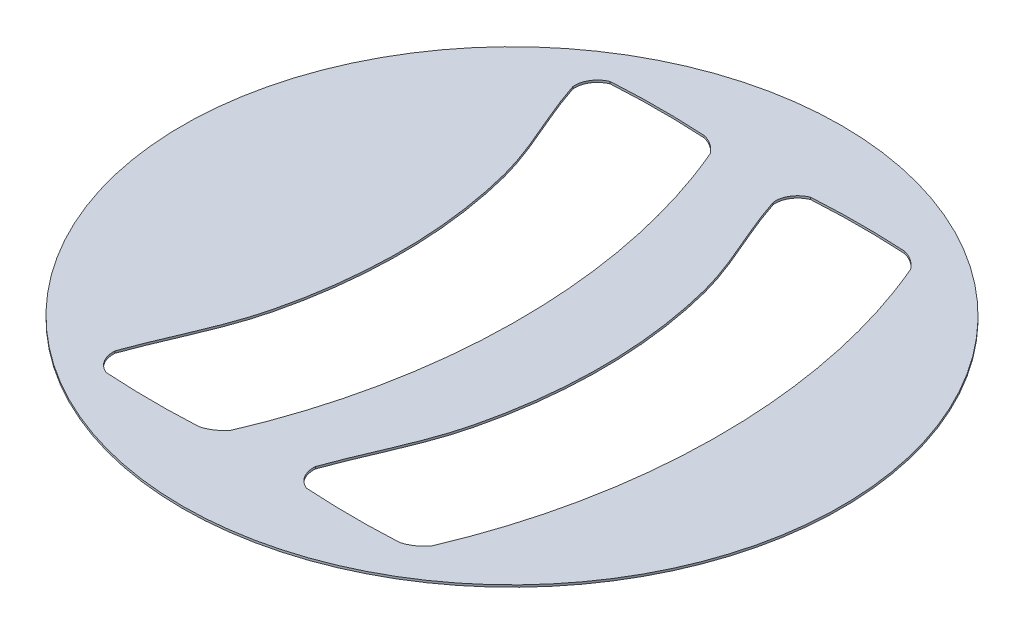
ISO-10303-21;
HEADER;
FILE_DESCRIPTION(('STEP AP214'),'2;1');
FILE_NAME('part.step','',(''),(''),'','','');
FILE_SCHEMA(('AUTOMOTIVE_DESIGN { 1 0 10303 214 1 1 1 1 }'));
ENDSEC;
DATA;
#1=APPLICATION_CONTEXT('core data for automotive mechanical design processes');
#2=APPLICATION_PROTOCOL_DEFINITION('international standard','automotive_design',2000,#1);
#3=PRODUCT_CONTEXT('',#1,'mechanical');
#4=PRODUCT('Part','Part','',(#3));
#5=PRODUCT_RELATED_PRODUCT_CATEGORY('part','',(#4));
#6=PRODUCT_DEFINITION_FORMATION('','',#4);
#7=PRODUCT_DEFINITION_CONTEXT('part definition',#1,'design');
#8=PRODUCT_DEFINITION('design','',#6,#7);
#9=PRODUCT_DEFINITION_SHAPE('','',#8);
#10=(LENGTH_UNIT() NAMED_UNIT(*) SI_UNIT(.MILLI.,.METRE.));
#11=(NAMED_UNIT(*) PLANE_ANGLE_UNIT() SI_UNIT($,.RADIAN.));
#12=(NAMED_UNIT(*) SI_UNIT($,.STERADIAN.) SOLID_ANGLE_UNIT());
#13=UNCERTAINTY_MEASURE_WITH_UNIT(LENGTH_MEASURE(1.E-05),#10,'distance_accuracy_value','');
#14=(GEOMETRIC_REPRESENTATION_CONTEXT(3) GLOBAL_UNCERTAINTY_ASSIGNED_CONTEXT((#13)) GLOBAL_UNIT_ASSIGNED_CONTEXT((#10,
#11,#12)) REPRESENTATION_CONTEXT('',''));
#15=CARTESIAN_POINT('',(0.,0.,0.));
#16=DIRECTION('',(0.,0.,1.));
#17=DIRECTION('',(1.,0.,0.));
#18=AXIS2_PLACEMENT_3D('',#15,#16,#17);
#19=CARTESIAN_POINT('',(-63.760090493305,0.8,86.7960424077123));
#20=CARTESIAN_POINT('',(-58.7628185247075,0.8,72.6085842167443));
#21=CARTESIAN_POINT('',(-51.546745001218,0.8,59.2384097112308));
#22=CARTESIAN_POINT('',(-44.1051711205455,0.8,30.0901740149443));
#23=CARTESIAN_POINT('',(-42.2533943518671,0.8,15.0473839709648));
#24=CARTESIAN_POINT('',(-42.2083653646232,0.8,-15.0362444166191));
#25=CARTESIAN_POINT('',(-44.1048962264668,0.8,-30.0803277028534));
#26=CARTESIAN_POINT('',(-51.5558686408152,0.8,-59.2266051277856));
#27=CARTESIAN_POINT('',(-59.1374389131156,0.8,-72.474291435868));
#28=CARTESIAN_POINT('',(-63.7453578797547,0.8,-86.7929429032606));
#29=B_SPLINE_CURVE_WITH_KNOTS('',3,(#19,#20,#21,#22,#23,#24,#25,#26,#27,#28),.UNSPECIFIED.,.F.,
.F.,(4,2,2,2,4),(0.,0.25,0.5,0.75,1.),.UNSPECIFIED.);
#30=DIRECTION('',(0.,-1.,0.));
#31=VECTOR('',#30,1.);
#32=SURFACE_OF_LINEAR_EXTRUSION('',#29,#31);
#33=CARTESIAN_POINT('',(-63.760090493305,0.,86.7960424077123));
#34=CARTESIAN_POINT('',(-58.7628185247075,0.,72.6085842167443));
#35=CARTESIAN_POINT('',(-51.546745001218,0.,59.2384097112308));
#36=CARTESIAN_POINT('',(-44.1051711205455,0.,30.0901740149443));
#37=CARTESIAN_POINT('',(-42.2533943518671,0.,15.0473839709648));
#38=CARTESIAN_POINT('',(-42.2083653646232,0.,-15.0362444166191));
#39=CARTESIAN_POINT('',(-44.1048962264668,0.,-30.0803277028534));
#40=CARTESIAN_POINT('',(-51.5558686408152,0.,-59.2266051277856));
#41=CARTESIAN_POINT('',(-59.1374389131156,0.,-72.474291435868));
#42=CARTESIAN_POINT('',(-63.7453578797547,0.,-86.7929429032606));
#43=B_SPLINE_CURVE_WITH_KNOTS('',3,(#33,#34,#35,#36,#37,#38,#39,#40,#41,#42),.UNSPECIFIED.,.F.,
.F.,(4,2,2,2,4),(0.,0.25,0.5,0.75,1.),.UNSPECIFIED.);
#44=CARTESIAN_POINT('',(-63.760090493305,0.,86.7960424077123));
#45=VERTEX_POINT('',#44);
#46=CARTESIAN_POINT('',(-63.7453578797547,0.,-86.7929429032606));
#47=VERTEX_POINT('',#46);
#48=EDGE_CURVE('E373',#45,#47,#43,.T.);
#49=ORIENTED_EDGE('',*,*,#48,.T.);
#50=DIRECTION('',(0.,-1.,0.));
#51=VECTOR('',#50,1.);
#52=CARTESIAN_POINT('',(-63.7453578797547,0.8,-86.7929429032606));
#53=LINE('',#52,#51);
#54=CARTESIAN_POINT('',(-63.7453578797547,0.8,-86.7929429032606));
#55=VERTEX_POINT('',#54);
#56=EDGE_CURVE('E11',#55,#47,#53,.T.);
#57=ORIENTED_EDGE('',*,*,#56,.F.);
#58=CARTESIAN_POINT('',(-63.760090493305,0.8,86.7960424077123));
#59=VERTEX_POINT('',#58);
#60=EDGE_CURVE('E234',#59,#55,#29,.T.);
#61=ORIENTED_EDGE('',*,*,#60,.F.);
#62=DIRECTION('',(0.,-1.,0.));
#63=VECTOR('',#62,1.);
#64=CARTESIAN_POINT('',(-63.760090493305,0.8,86.7960424077123));
#65=LINE('',#64,#63);
#66=EDGE_CURVE('E415',#59,#45,#65,.T.);
#67=ORIENTED_EDGE('',*,*,#66,.T.);
#68=EDGE_LOOP('',(#49,#57,#61,#67));
#69=FACE_BOUND('',#68,.T.);
#70=ADVANCED_FACE('F40',(#69),#32,.F.);
#71=CARTESIAN_POINT('',(-63.7453578797547,0.8,-86.7929429032605));
#72=CARTESIAN_POINT('',(-64.138441060353,0.8,-90.601686389006));
#73=CARTESIAN_POINT('',(-61.8806418854337,0.8,-94.0724366599432));
#74=CARTESIAN_POINT('',(-58.3625296994832,0.8,-95.5837036694846));
#75=B_SPLINE_CURVE_WITH_KNOTS('',3,(#71,#72,#73,#74),.UNSPECIFIED.,.F.,.F.,(4,4),(0.,1.),.UNSPECIFIED.);
#76=DIRECTION('',(0.,-1.,0.));
#77=VECTOR('',#76,1.);
#78=SURFACE_OF_LINEAR_EXTRUSION('',#75,#77);
#79=CARTESIAN_POINT('',(-63.7453578797547,0.,-86.7929429032605));
#80=CARTESIAN_POINT('',(-64.138441060353,0.,-90.601686389006));
#81=CARTESIAN_POINT('',(-61.8806418854337,0.,-94.0724366599432));
#82=CARTESIAN_POINT('',(-58.3625296994832,0.,-95.5837036694846));
#83=B_SPLINE_CURVE_WITH_KNOTS('',3,(#79,#80,#81,#82),.UNSPECIFIED.,.F.,.F.,(4,4),(0.,1.),.UNSPECIFIED.);
#84=CARTESIAN_POINT('',(-58.3625296994832,0.,-95.5837036694837));
#85=VERTEX_POINT('',#84);
#86=EDGE_CURVE('E381',#47,#85,#83,.T.);
#87=ORIENTED_EDGE('',*,*,#86,.T.);
#88=DIRECTION('',(0.,-1.,0.));
#89=VECTOR('',#88,1.);
#90=CARTESIAN_POINT('',(-58.3625296994832,0.8,-95.5837036694837));
#91=LINE('',#90,#89);
#92=CARTESIAN_POINT('',(-58.3625296994832,0.8,-95.5837036694837));
#93=VERTEX_POINT('',#92);
#94=EDGE_CURVE('E50',#93,#85,#91,.T.);
#95=ORIENTED_EDGE('',*,*,#94,.F.);
#96=EDGE_CURVE('E229',#55,#93,#75,.T.);
#97=ORIENTED_EDGE('',*,*,#96,.F.);
#98=ORIENTED_EDGE('',*,*,#56,.T.);
#99=EDGE_LOOP('',(#87,#95,#97,#98));
#100=FACE_BOUND('',#99,.T.);
#101=ADVANCED_FACE('F243',(#100),#78,.F.);
#102=CARTESIAN_POINT('',(-39.8465374099125,0.8,193.334513294458));
#103=DIRECTION('',(0.,-1.,0.));
#104=DIRECTION('',(0.,0.,-1.));
#105=AXIS2_PLACEMENT_3D('',#102,#103,#104);
#106=CYLINDRICAL_SURFACE('',#105,289.510929092652);
#107=CARTESIAN_POINT('',(-39.8465374099125,0.,193.334513294458));
#108=DIRECTION('',(0.,1.,0.));
#109=DIRECTION('',(0.,0.,1.));
#110=AXIS2_PLACEMENT_3D('',#107,#108,#109);
#111=CIRCLE('',#110,289.510929092652);
#112=CARTESIAN_POINT('',(-22.840181977188,0.,-95.6764933108036));
#113=VERTEX_POINT('',#112);
#114=EDGE_CURVE('E388',#85,#113,#111,.F.);
#115=ORIENTED_EDGE('',*,*,#114,.T.);
#116=DIRECTION('',(0.,-1.,0.));
#117=VECTOR('',#116,1.);
#118=CARTESIAN_POINT('',(-22.840181977188,0.8,-95.6764933108036));
#119=LINE('',#118,#117);
#120=CARTESIAN_POINT('',(-22.840181977188,0.8,-95.6764933108036));
#121=VERTEX_POINT('',#120);
#122=EDGE_CURVE('E424',#121,#113,#119,.T.);
#123=ORIENTED_EDGE('',*,*,#122,.F.);
#124=CARTESIAN_POINT('',(-39.8465374099125,0.8,193.334513294458));
#125=DIRECTION('',(0.,1.,0.));
#126=DIRECTION('',(0.,0.,1.));
#127=AXIS2_PLACEMENT_3D('',#124,#125,#126);
#128=CIRCLE('',#127,289.510929092652);
#129=EDGE_CURVE('E224',#93,#121,#128,.F.);
#130=ORIENTED_EDGE('',*,*,#129,.F.);
#131=ORIENTED_EDGE('',*,*,#94,.T.);
#132=EDGE_LOOP('',(#115,#123,#130,#131));
#133=FACE_BOUND('',#132,.T.);
#134=ADVANCED_FACE('F246',(#133),#106,.F.);
#135=CARTESIAN_POINT('',(-22.8401819771896,0.8,-95.6764933108048));
#136=CARTESIAN_POINT('',(-19.9176540295161,0.8,-94.9962312894756));
#137=CARTESIAN_POINT('',(-17.4357990087601,0.8,-93.1947706150574));
#138=CARTESIAN_POINT('',(-15.6381900856996,0.8,-90.7921619947685));
#139=B_SPLINE_CURVE_WITH_KNOTS('',3,(#135,#136,#137,#138),.UNSPECIFIED.,.F.,.F.,(4,4),(0.,1.),.UNSPECIFIED.);
#140=DIRECTION('',(0.,-1.,0.));
#141=VECTOR('',#140,1.);
#142=SURFACE_OF_LINEAR_EXTRUSION('',#139,#141);
#143=CARTESIAN_POINT('',(-22.8401819771896,0.,-95.6764933108048));
#144=CARTESIAN_POINT('',(-19.9176540295161,0.,-94.9962312894756));
#145=CARTESIAN_POINT('',(-17.4357990087601,0.,-93.1947706150574));
#146=CARTESIAN_POINT('',(-15.6381900856996,0.,-90.7921619947685));
#147=B_SPLINE_CURVE_WITH_KNOTS('',3,(#143,#144,#145,#146),.UNSPECIFIED.,.F.,.F.,(4,4),(0.,1.),.UNSPECIFIED.);
#148=CARTESIAN_POINT('',(-15.6381900857,0.,-90.7921619947693));
#149=VERTEX_POINT('',#148);
#150=EDGE_CURVE('E393',#113,#149,#147,.T.);
#151=ORIENTED_EDGE('',*,*,#150,.T.);
#152=DIRECTION('',(0.,-1.,0.));
#153=VECTOR('',#152,1.);
#154=CARTESIAN_POINT('',(-15.6381900857,0.8,-90.7921619947693));
#155=LINE('',#154,#153);
#156=CARTESIAN_POINT('',(-15.6381900857,0.8,-90.7921619947693));
#157=VERTEX_POINT('',#156);
#158=EDGE_CURVE('E422',#157,#149,#155,.T.);
#159=ORIENTED_EDGE('',*,*,#158,.F.);
#160=EDGE_CURVE('E219',#121,#157,#139,.T.);
#161=ORIENTED_EDGE('',*,*,#160,.F.);
#162=ORIENTED_EDGE('',*,*,#122,.T.);
#163=EDGE_LOOP('',(#151,#159,#161,#162));
#164=FACE_BOUND('',#163,.T.);
#165=ADVANCED_FACE('F214',(#164),#142,.F.);
#166=CARTESIAN_POINT('',(-154.646830689824,0.8,-0.187171784051202));
#167=DIRECTION('',(0.,1.,0.));
#168=DIRECTION('',(0.00271674553066771,0.,0.999996309640051));
#169=AXIS2_PLACEMENT_3D('',#166,#167,#168);
#170=ELLIPSE('',#169,194.151293524427,157.268621177229);
#171=DIRECTION('',(0.,-1.,0.));
#172=VECTOR('',#171,1.);
#173=SURFACE_OF_LINEAR_EXTRUSION('',#170,#172);
#174=CARTESIAN_POINT('',(-154.646830689824,0.,-0.187171784051202));
#175=DIRECTION('',(0.,1.,0.));
#176=DIRECTION('',(0.00271674553066771,0.,0.999996309640051));
#177=AXIS2_PLACEMENT_3D('',#174,#175,#176);
#178=ELLIPSE('',#177,194.151293524427,157.268621177229);
#179=CARTESIAN_POINT('',(-15.6493149665801,0.,90.8395591257512));
#180=VERTEX_POINT('',#179);
#181=EDGE_CURVE('E398',#180,#149,#178,.T.);
#182=ORIENTED_EDGE('',*,*,#181,.F.);
#183=DIRECTION('',(0.,-1.,0.));
#184=VECTOR('',#183,1.);
#185=CARTESIAN_POINT('',(-15.6493149665801,0.8,90.8395591257512));
#186=LINE('',#185,#184);
#187=CARTESIAN_POINT('',(-15.6493149665801,0.8,90.8395591257512));
#188=VERTEX_POINT('',#187);
#189=EDGE_CURVE('E179',#188,#180,#186,.T.);
#190=ORIENTED_EDGE('',*,*,#189,.F.);
#191=EDGE_CURVE('E172',#188,#157,#170,.T.);
#192=ORIENTED_EDGE('',*,*,#191,.T.);
#193=ORIENTED_EDGE('',*,*,#158,.T.);
#194=EDGE_LOOP('',(#182,#190,#192,#193));
#195=FACE_BOUND('',#194,.T.);
#196=ADVANCED_FACE('F211',(#195),#173,.T.);
#197=CARTESIAN_POINT('',(-15.6493149665797,0.8,90.8395591257503));
#198=CARTESIAN_POINT('',(-17.4637409886561,0.8,93.2547276595145));
#199=CARTESIAN_POINT('',(-19.9919420951581,0.8,95.0053504628634));
#200=CARTESIAN_POINT('',(-22.9156128585138,0.8,95.7651728786771));
#201=B_SPLINE_CURVE_WITH_KNOTS('',3,(#197,#198,#199,#200),.UNSPECIFIED.,.F.,.F.,(4,4),(0.,1.),.UNSPECIFIED.);
#202=DIRECTION('',(0.,-1.,0.));
#203=VECTOR('',#202,1.);
#204=SURFACE_OF_LINEAR_EXTRUSION('',#201,#203);
#205=CARTESIAN_POINT('',(-15.6493149665797,0.,90.8395591257503));
#206=CARTESIAN_POINT('',(-17.4637409886561,0.,93.2547276595145));
#207=CARTESIAN_POINT('',(-19.9919420951581,0.,95.0053504628634));
#208=CARTESIAN_POINT('',(-22.9156128585138,0.,95.7651728786771));
#209=B_SPLINE_CURVE_WITH_KNOTS('',3,(#205,#206,#207,#208),.UNSPECIFIED.,.F.,.F.,(4,4),(0.,1.),.UNSPECIFIED.);
#210=CARTESIAN_POINT('',(-22.915612858512,0.,95.7651728786768));
#211=VERTEX_POINT('',#210);
#212=EDGE_CURVE('E178',#180,#211,#209,.T.);
#213=ORIENTED_EDGE('',*,*,#212,.T.);
#214=DIRECTION('',(0.,-1.,0.));
#215=VECTOR('',#214,1.);
#216=CARTESIAN_POINT('',(-22.915612858512,0.8,95.7651728786768));
#217=LINE('',#216,#215);
#218=CARTESIAN_POINT('',(-22.915612858512,0.8,95.7651728786768));
#219=VERTEX_POINT('',#218);
#220=EDGE_CURVE('E175',#219,#211,#217,.T.);
#221=ORIENTED_EDGE('',*,*,#220,.F.);
#222=EDGE_CURVE('E166',#188,#219,#201,.T.);
#223=ORIENTED_EDGE('',*,*,#222,.F.);
#224=ORIENTED_EDGE('',*,*,#189,.T.);
#225=EDGE_LOOP('',(#213,#221,#223,#224));
#226=FACE_BOUND('',#225,.T.);
#227=ADVANCED_FACE('F176',(#226),#204,.F.);
#228=CARTESIAN_POINT('',(-39.1939977177405,0.8,-200.020572821292));
#229=DIRECTION('',(0.,-1.,0.));
#230=DIRECTION('',(0.,0.,-1.));
#231=AXIS2_PLACEMENT_3D('',#228,#229,#230);
#232=CYLINDRICAL_SURFACE('',#231,296.233342439556);
#233=CARTESIAN_POINT('',(-39.1939977177405,0.,-200.020572821292));
#234=DIRECTION('',(0.,1.,0.));
#235=DIRECTION('',(0.,0.,1.));
#236=AXIS2_PLACEMENT_3D('',#233,#234,#235);
#237=CIRCLE('',#236,296.233342439556);
#238=CARTESIAN_POINT('',(-58.362853206488,0.,95.5919237889887));
#239=VERTEX_POINT('',#238);
#240=EDGE_CURVE('E112',#211,#239,#237,.F.);
#241=ORIENTED_EDGE('',*,*,#240,.T.);
#242=DIRECTION('',(0.,-1.,0.));
#243=VECTOR('',#242,1.);
#244=CARTESIAN_POINT('',(-58.362853206488,0.8,95.5919237889887));
#245=LINE('',#244,#243);
#246=CARTESIAN_POINT('',(-58.362853206488,0.8,95.5919237889887));
#247=VERTEX_POINT('',#246);
#248=EDGE_CURVE('E180',#247,#239,#245,.T.);
#249=ORIENTED_EDGE('',*,*,#248,.F.);
#250=CARTESIAN_POINT('',(-39.1939977177405,0.8,-200.020572821292));
#251=DIRECTION('',(0.,1.,0.));
#252=DIRECTION('',(0.,0.,1.));
#253=AXIS2_PLACEMENT_3D('',#250,#251,#252);
#254=CIRCLE('',#253,296.233342439556);
#255=EDGE_CURVE('E170',#219,#247,#254,.F.);
#256=ORIENTED_EDGE('',*,*,#255,.F.);
#257=ORIENTED_EDGE('',*,*,#220,.T.);
#258=EDGE_LOOP('',(#241,#249,#256,#257));
#259=FACE_BOUND('',#258,.T.);
#260=ADVANCED_FACE('F182',(#259),#232,.F.);
#261=CARTESIAN_POINT('',(36.1534625900875,0.8,193.334513294455));
#262=DIRECTION('',(0.,-1.,0.));
#263=DIRECTION('',(0.,0.,-1.));
#264=AXIS2_PLACEMENT_3D('',#261,#262,#263);
#265=CYLINDRICAL_SURFACE('',#264,289.510929092649);
#266=CARTESIAN_POINT('',(36.1534625900875,0.,193.334513294455));
#267=DIRECTION('',(0.,1.,0.));
#268=DIRECTION('',(0.,0.,1.));
#269=AXIS2_PLACEMENT_3D('',#266,#267,#268);
#270=CIRCLE('',#269,289.510929092649);
#271=CARTESIAN_POINT('',(17.6374703005169,0.,-95.5837036694837));
#272=VERTEX_POINT('',#271);
#273=CARTESIAN_POINT('',(53.1598180228121,0.,-95.6764933108036));
#274=VERTEX_POINT('',#273);
#275=EDGE_CURVE('E328',#272,#274,#270,.F.);
#276=ORIENTED_EDGE('',*,*,#275,.T.);
#277=DIRECTION('',(0.,-1.,0.));
#278=VECTOR('',#277,1.);
#279=CARTESIAN_POINT('',(53.1598180228121,0.8,-95.6764933108036));
#280=LINE('',#279,#278);
#281=CARTESIAN_POINT('',(53.1598180228121,0.8,-95.6764933108036));
#282=VERTEX_POINT('',#281);
#283=EDGE_CURVE('E44',#282,#274,#280,.T.);
#284=ORIENTED_EDGE('',*,*,#283,.F.);
#285=CARTESIAN_POINT('',(36.1534625900875,0.8,193.334513294455));
#286=DIRECTION('',(0.,1.,0.));
#287=DIRECTION('',(0.,0.,1.));
#288=AXIS2_PLACEMENT_3D('',#285,#286,#287);
#289=CIRCLE('',#288,289.510929092649);
#290=CARTESIAN_POINT('',(17.6374703005169,0.8,-95.5837036694837));
#291=VERTEX_POINT('',#290);
#292=EDGE_CURVE('E313',#291,#282,#289,.F.);
#293=ORIENTED_EDGE('',*,*,#292,.F.);
#294=DIRECTION('',(0.,-1.,0.));
#295=VECTOR('',#294,1.);
#296=CARTESIAN_POINT('',(17.6374703005169,0.8,-95.5837036694837));
#297=LINE('',#296,#295);
#298=EDGE_CURVE('E184',#291,#272,#297,.T.);
#299=ORIENTED_EDGE('',*,*,#298,.T.);
#300=EDGE_LOOP('',(#276,#284,#293,#299));
#301=FACE_BOUND('',#300,.T.);
#302=ADVANCED_FACE('F208',(#301),#265,.F.);
#303=CARTESIAN_POINT('',(53.1598180228117,0.8,-95.6764933108038));
#304=CARTESIAN_POINT('',(56.0823459704891,0.8,-94.9962312894761));
#305=CARTESIAN_POINT('',(58.5642009912423,0.8,-93.194770615059));
#306=CARTESIAN_POINT('',(60.3618099143041,0.8,-90.7921619947709));
#307=B_SPLINE_CURVE_WITH_KNOTS('',3,(#303,#304,#305,#306),.UNSPECIFIED.,.F.,.F.,(4,4),(0.,1.),.UNSPECIFIED.);
#308=DIRECTION('',(0.,-1.,0.));
#309=VECTOR('',#308,1.);
#310=SURFACE_OF_LINEAR_EXTRUSION('',#307,#309);
#311=CARTESIAN_POINT('',(53.1598180228117,0.,-95.6764933108038));
#312=CARTESIAN_POINT('',(56.0823459704891,0.,-94.9962312894761));
#313=CARTESIAN_POINT('',(58.5642009912423,0.,-93.194770615059));
#314=CARTESIAN_POINT('',(60.3618099143041,0.,-90.7921619947709));
#315=B_SPLINE_CURVE_WITH_KNOTS('',3,(#311,#312,#313,#314),.UNSPECIFIED.,.F.,.F.,(4,4),(0.,1.),.UNSPECIFIED.);
#316=CARTESIAN_POINT('',(60.361809914304,0.,-90.7921619947711));
#317=VERTEX_POINT('',#316);
#318=EDGE_CURVE('E333',#274,#317,#315,.T.);
#319=ORIENTED_EDGE('',*,*,#318,.T.);
#320=DIRECTION('',(0.,-1.,0.));
#321=VECTOR('',#320,1.);
#322=CARTESIAN_POINT('',(60.361809914304,0.8,-90.7921619947711));
#323=LINE('',#322,#321);
#324=CARTESIAN_POINT('',(60.361809914304,0.8,-90.7921619947711));
#325=VERTEX_POINT('',#324);
#326=EDGE_CURVE('E443',#325,#317,#323,.T.);
#327=ORIENTED_EDGE('',*,*,#326,.F.);
#328=EDGE_CURVE('E127',#282,#325,#307,.T.);
#329=ORIENTED_EDGE('',*,*,#328,.F.);
#330=ORIENTED_EDGE('',*,*,#283,.T.);
#331=EDGE_LOOP('',(#319,#327,#329,#330));
#332=FACE_BOUND('',#331,.T.);
#333=ADVANCED_FACE('F318',(#332),#310,.F.);
#334=CARTESIAN_POINT('',(-78.6468306899286,0.8,-0.187171784053655));
#335=DIRECTION('',(0.,1.,0.));
#336=DIRECTION('',(0.00271674553070339,0.,0.999996309640051));
#337=AXIS2_PLACEMENT_3D('',#334,#335,#336);
#338=ELLIPSE('',#337,194.151293524493,157.268621177338);
#339=DIRECTION('',(0.,-1.,0.));
#340=VECTOR('',#339,1.);
#341=SURFACE_OF_LINEAR_EXTRUSION('',#338,#340);
#342=CARTESIAN_POINT('',(-78.6468306899286,0.,-0.187171784053655));
#343=DIRECTION('',(0.,1.,0.));
#344=DIRECTION('',(0.00271674553070339,0.,0.999996309640051));
#345=AXIS2_PLACEMENT_3D('',#342,#343,#344);
#346=ELLIPSE('',#345,194.151293524493,157.268621177338);
#347=CARTESIAN_POINT('',(60.3506850334238,0.,90.8395591257529));
#348=VERTEX_POINT('',#347);
#349=EDGE_CURVE('E335',#348,#317,#346,.T.);
#350=ORIENTED_EDGE('',*,*,#349,.F.);
#351=DIRECTION('',(0.,-1.,0.));
#352=VECTOR('',#351,1.);
#353=CARTESIAN_POINT('',(60.3506850334238,0.8,90.8395591257529));
#354=LINE('',#353,#352);
#355=CARTESIAN_POINT('',(60.3506850334238,0.8,90.8395591257529));
#356=VERTEX_POINT('',#355);
#357=EDGE_CURVE('E442',#356,#348,#354,.T.);
#358=ORIENTED_EDGE('',*,*,#357,.F.);
#359=EDGE_CURVE('E302',#356,#325,#338,.T.);
#360=ORIENTED_EDGE('',*,*,#359,.T.);
#361=ORIENTED_EDGE('',*,*,#326,.T.);
#362=EDGE_LOOP('',(#350,#358,#360,#361));
#363=FACE_BOUND('',#362,.T.);
#364=ADVANCED_FACE('F294',(#363),#341,.T.);
#365=CARTESIAN_POINT('',(60.3506850334239,0.8,90.8395591257527));
#366=CARTESIAN_POINT('',(58.5362590113465,0.8,93.254727659516));
#367=CARTESIAN_POINT('',(56.0080579048401,0.8,95.0053504628638));
#368=CARTESIAN_POINT('',(53.0843871414876,0.8,95.7651728786762));
#369=B_SPLINE_CURVE_WITH_KNOTS('',3,(#365,#366,#367,#368),.UNSPECIFIED.,.F.,.F.,(4,4),(0.,1.),.UNSPECIFIED.);
#370=DIRECTION('',(0.,-1.,0.));
#371=VECTOR('',#370,1.);
#372=SURFACE_OF_LINEAR_EXTRUSION('',#369,#371);
#373=CARTESIAN_POINT('',(60.3506850334239,0.,90.8395591257527));
#374=CARTESIAN_POINT('',(58.5362590113465,0.,93.254727659516));
#375=CARTESIAN_POINT('',(56.0080579048401,0.,95.0053504628638));
#376=CARTESIAN_POINT('',(53.0843871414876,0.,95.7651728786762));
#377=B_SPLINE_CURVE_WITH_KNOTS('',3,(#373,#374,#375,#376),.UNSPECIFIED.,.F.,.F.,(4,4),(0.,1.),.UNSPECIFIED.);
#378=CARTESIAN_POINT('',(53.0843871414879,0.,95.7651728786759));
#379=VERTEX_POINT('',#378);
#380=EDGE_CURVE('E346',#348,#379,#377,.T.);
#381=ORIENTED_EDGE('',*,*,#380,.T.);
#382=DIRECTION('',(0.,-1.,0.));
#383=VECTOR('',#382,1.);
#384=CARTESIAN_POINT('',(53.0843871414879,0.8,95.7651728786759));
#385=LINE('',#384,#383);
#386=CARTESIAN_POINT('',(53.0843871414879,0.8,95.7651728786759));
#387=VERTEX_POINT('',#386);
#388=EDGE_CURVE('E439',#387,#379,#385,.T.);
#389=ORIENTED_EDGE('',*,*,#388,.F.);
#390=EDGE_CURVE('E298',#356,#387,#369,.T.);
#391=ORIENTED_EDGE('',*,*,#390,.F.);
#392=ORIENTED_EDGE('',*,*,#357,.T.);
#393=EDGE_LOOP('',(#381,#389,#391,#392));
#394=FACE_BOUND('',#393,.T.);
#395=ADVANCED_FACE('F290',(#394),#372,.F.);
#396=CARTESIAN_POINT('',(36.8060022822463,0.8,-200.020572821295));
#397=DIRECTION('',(0.,-1.,0.));
#398=DIRECTION('',(0.,0.,-1.));
#399=AXIS2_PLACEMENT_3D('',#396,#397,#398);
#400=CYLINDRICAL_SURFACE('',#399,296.23334243956);
#401=CARTESIAN_POINT('',(36.8060022822463,0.,-200.020572821295));
#402=DIRECTION('',(0.,1.,0.));
#403=DIRECTION('',(0.,0.,1.));
#404=AXIS2_PLACEMENT_3D('',#401,#402,#403);
#405=CIRCLE('',#404,296.23334243956);
#406=CARTESIAN_POINT('',(17.6371467935119,0.,95.5919237889895));
#407=VERTEX_POINT('',#406);
#408=EDGE_CURVE('E350',#379,#407,#405,.F.);
#409=ORIENTED_EDGE('',*,*,#408,.T.);
#410=DIRECTION('',(0.,-1.,0.));
#411=VECTOR('',#410,1.);
#412=CARTESIAN_POINT('',(17.6371467935119,0.8,95.5919237889895));
#413=LINE('',#412,#411);
#414=CARTESIAN_POINT('',(17.6371467935119,0.8,95.5919237889895));
#415=VERTEX_POINT('',#414);
#416=EDGE_CURVE('E436',#415,#407,#413,.T.);
#417=ORIENTED_EDGE('',*,*,#416,.F.);
#418=CARTESIAN_POINT('',(36.8060022822463,0.8,-200.020572821295));
#419=DIRECTION('',(0.,1.,0.));
#420=DIRECTION('',(0.,0.,1.));
#421=AXIS2_PLACEMENT_3D('',#418,#419,#420);
#422=CIRCLE('',#421,296.23334243956);
#423=EDGE_CURVE('E278',#387,#415,#422,.F.);
#424=ORIENTED_EDGE('',*,*,#423,.F.);
#425=ORIENTED_EDGE('',*,*,#388,.T.);
#426=EDGE_LOOP('',(#409,#417,#424,#425));
#427=FACE_BOUND('',#426,.T.);
#428=ADVANCED_FACE('F286',(#427),#400,.F.);
#429=CARTESIAN_POINT('',(17.6371467935118,0.8,95.5919237889894));
#430=CARTESIAN_POINT('',(14.0789188578137,0.8,94.1778417705216));
#431=CARTESIAN_POINT('',(11.9667711870911,0.8,90.6152058574449));
#432=CARTESIAN_POINT('',(12.2399095066951,0.8,86.7960424077128));
#433=B_SPLINE_CURVE_WITH_KNOTS('',3,(#429,#430,#431,#432),.UNSPECIFIED.,.F.,.F.,(4,4),(0.,1.),.UNSPECIFIED.);
#434=DIRECTION('',(0.,-1.,0.));
#435=VECTOR('',#434,1.);
#436=SURFACE_OF_LINEAR_EXTRUSION('',#433,#435);
#437=CARTESIAN_POINT('',(17.6371467935118,0.,95.5919237889894));
#438=CARTESIAN_POINT('',(14.0789188578137,0.,94.1778417705216));
#439=CARTESIAN_POINT('',(11.9667711870911,0.,90.6152058574449));
#440=CARTESIAN_POINT('',(12.2399095066951,0.,86.7960424077128));
#441=B_SPLINE_CURVE_WITH_KNOTS('',3,(#437,#438,#439,#440),.UNSPECIFIED.,.F.,.F.,(4,4),(0.,1.),.UNSPECIFIED.);
#442=CARTESIAN_POINT('',(12.2399095066951,0.,86.7960424077128));
#443=VERTEX_POINT('',#442);
#444=EDGE_CURVE('E355',#407,#443,#441,.T.);
#445=ORIENTED_EDGE('',*,*,#444,.T.);
#446=DIRECTION('',(0.,-1.,0.));
#447=VECTOR('',#446,1.);
#448=CARTESIAN_POINT('',(12.2399095066951,0.8,86.7960424077128));
#449=LINE('',#448,#447);
#450=CARTESIAN_POINT('',(12.2399095066951,0.8,86.7960424077128));
#451=VERTEX_POINT('',#450);
#452=EDGE_CURVE('E433',#451,#443,#449,.T.);
#453=ORIENTED_EDGE('',*,*,#452,.F.);
#454=EDGE_CURVE('E270',#415,#451,#433,.T.);
#455=ORIENTED_EDGE('',*,*,#454,.F.);
#456=ORIENTED_EDGE('',*,*,#416,.T.);
#457=EDGE_LOOP('',(#445,#453,#455,#456));
#458=FACE_BOUND('',#457,.T.);
#459=ADVANCED_FACE('F283',(#458),#436,.F.);
#460=CARTESIAN_POINT('',(12.2399095066951,0.8,86.796042407713));
#461=CARTESIAN_POINT('',(17.2371814752926,0.8,72.608584216745));
#462=CARTESIAN_POINT('',(24.4532549987893,0.8,59.2384097112314));
#463=CARTESIAN_POINT('',(31.8948288794474,0.8,30.0901740149449));
#464=CARTESIAN_POINT('',(33.7466056481253,0.8,15.0473839709653));
#465=CARTESIAN_POINT('',(33.7916346353837,0.8,-15.0362444166185));
#466=CARTESIAN_POINT('',(31.8951037735258,0.8,-30.0803277028528));
#467=CARTESIAN_POINT('',(24.4441313591917,0.8,-59.226605127785));
#468=CARTESIAN_POINT('',(16.8625610868841,0.8,-72.4742914358674));
#469=CARTESIAN_POINT('',(12.254642120245,0.8,-86.7929429032599));
#470=B_SPLINE_CURVE_WITH_KNOTS('',3,(#460,#461,#462,#463,#464,#465,#466,#467,#468,#469),
.UNSPECIFIED.,.F.,.F.,(4,2,2,2,4),(0.,0.25,0.5,0.75,1.),.UNSPECIFIED.);
#471=DIRECTION('',(0.,-1.,0.));
#472=VECTOR('',#471,1.);
#473=SURFACE_OF_LINEAR_EXTRUSION('',#470,#472);
#474=CARTESIAN_POINT('',(12.2399095066951,0.,86.796042407713));
#475=CARTESIAN_POINT('',(17.2371814752926,0.,72.608584216745));
#476=CARTESIAN_POINT('',(24.4532549987893,0.,59.2384097112314));
#477=CARTESIAN_POINT('',(31.8948288794474,0.,30.0901740149449));
#478=CARTESIAN_POINT('',(33.7466056481253,0.,15.0473839709653));
#479=CARTESIAN_POINT('',(33.7916346353837,0.,-15.0362444166185));
#480=CARTESIAN_POINT('',(31.8951037735258,0.,-30.0803277028528));
#481=CARTESIAN_POINT('',(24.4441313591917,0.,-59.226605127785));
#482=CARTESIAN_POINT('',(16.8625610868841,0.,-72.4742914358674));
#483=CARTESIAN_POINT('',(12.254642120245,0.,-86.7929429032599));
#484=B_SPLINE_CURVE_WITH_KNOTS('',3,(#474,#475,#476,#477,#478,#479,#480,#481,#482,#483),
.UNSPECIFIED.,.F.,.F.,(4,2,2,2,4),(0.,0.25,0.5,0.75,1.),.UNSPECIFIED.);
#485=CARTESIAN_POINT('',(12.254642120245,0.,-86.7929429032599));
#486=VERTEX_POINT('',#485);
#487=EDGE_CURVE('E359',#443,#486,#484,.T.);
#488=ORIENTED_EDGE('',*,*,#487,.T.);
#489=DIRECTION('',(0.,-1.,0.));
#490=VECTOR('',#489,1.);
#491=CARTESIAN_POINT('',(12.254642120245,0.8,-86.7929429032599));
#492=LINE('',#491,#490);
#493=CARTESIAN_POINT('',(12.254642120245,0.8,-86.7929429032599));
#494=VERTEX_POINT('',#493);
#495=EDGE_CURVE('E430',#494,#486,#492,.T.);
#496=ORIENTED_EDGE('',*,*,#495,.F.);
#497=EDGE_CURVE('E262',#451,#494,#470,.T.);
#498=ORIENTED_EDGE('',*,*,#497,.F.);
#499=ORIENTED_EDGE('',*,*,#452,.T.);
#500=EDGE_LOOP('',(#488,#496,#498,#499));
#501=FACE_BOUND('',#500,.T.);
#502=ADVANCED_FACE('F254',(#501),#473,.F.);
#503=CARTESIAN_POINT('',(12.2546421202451,0.8,-86.7929429032601));
#504=CARTESIAN_POINT('',(11.8615589396434,0.8,-90.6016863890058));
#505=CARTESIAN_POINT('',(14.1193581145637,0.8,-94.072436659943));
#506=CARTESIAN_POINT('',(17.637470300517,0.8,-95.583703669484));
#507=B_SPLINE_CURVE_WITH_KNOTS('',3,(#503,#504,#505,#506),.UNSPECIFIED.,.F.,.F.,(4,4),(0.,1.),.UNSPECIFIED.);
#508=DIRECTION('',(0.,-1.,0.));
#509=VECTOR('',#508,1.);
#510=SURFACE_OF_LINEAR_EXTRUSION('',#507,#509);
#511=CARTESIAN_POINT('',(12.2546421202451,0.,-86.7929429032601));
#512=CARTESIAN_POINT('',(11.8615589396434,0.,-90.6016863890058));
#513=CARTESIAN_POINT('',(14.1193581145637,0.,-94.072436659943));
#514=CARTESIAN_POINT('',(17.637470300517,0.,-95.583703669484));
#515=B_SPLINE_CURVE_WITH_KNOTS('',3,(#511,#512,#513,#514),.UNSPECIFIED.,.F.,.F.,(4,4),(0.,1.),.UNSPECIFIED.);
#516=EDGE_CURVE('E366',#486,#272,#515,.T.);
#517=ORIENTED_EDGE('',*,*,#516,.T.);
#518=ORIENTED_EDGE('',*,*,#298,.F.);
#519=EDGE_CURVE('E258',#494,#291,#507,.T.);
#520=ORIENTED_EDGE('',*,*,#519,.F.);
#521=ORIENTED_EDGE('',*,*,#495,.T.);
#522=EDGE_LOOP('',(#517,#518,#520,#521));
#523=FACE_BOUND('',#522,.T.);
#524=ADVANCED_FACE('F251',(#523),#510,.F.);
#525=CARTESIAN_POINT('',(0.,0.8,0.));
#526=DIRECTION('',(0.,-1.,0.));
#527=DIRECTION('',(0.,0.,-1.));
#528=AXIS2_PLACEMENT_3D('',#525,#526,#527);
#529=CYLINDRICAL_SURFACE('',#528,125.);
#530=CARTESIAN_POINT('',(0.,0.8,0.));
#531=DIRECTION('',(0.,1.,0.));
#532=DIRECTION('',(0.,0.,1.));
#533=AXIS2_PLACEMENT_3D('',#530,#531,#532);
#534=CIRCLE('',#533,125.);
#535=CARTESIAN_POINT('',(0.,0.8,125.));
#536=VERTEX_POINT('',#535);
#537=EDGE_CURVE('E414',#536,#536,#534,.T.);
#538=ORIENTED_EDGE('',*,*,#537,.F.);
#539=EDGE_LOOP('',(#538));
#540=FACE_BOUND('',#539,.T.);
#541=CARTESIAN_POINT('',(0.,0.,0.));
#542=DIRECTION('',(0.,1.,0.));
#543=DIRECTION('',(0.,0.,1.));
#544=AXIS2_PLACEMENT_3D('',#541,#542,#543);
#545=CIRCLE('',#544,125.);
#546=CARTESIAN_POINT('',(0.,0.,125.));
#547=VERTEX_POINT('',#546);
#548=EDGE_CURVE('E194',#547,#547,#545,.T.);
#549=ORIENTED_EDGE('',*,*,#548,.T.);
#550=EDGE_LOOP('',(#549));
#551=FACE_BOUND('',#550,.T.);
#552=ADVANCED_FACE('F42',(#540,#551),#529,.T.);
#553=CARTESIAN_POINT('',(-58.3628532064884,0.8,95.591923788989));
#554=CARTESIAN_POINT('',(-61.92108114219,0.8,94.1778417705212));
#555=CARTESIAN_POINT('',(-64.0332288129091,0.8,90.6152058574444));
#556=CARTESIAN_POINT('',(-63.760090493305,0.8,86.7960424077123));
#557=B_SPLINE_CURVE_WITH_KNOTS('',3,(#553,#554,#555,#556),.UNSPECIFIED.,.F.,.F.,(4,4),(0.,1.),.UNSPECIFIED.);
#558=DIRECTION('',(0.,-1.,0.));
#559=VECTOR('',#558,1.);
#560=SURFACE_OF_LINEAR_EXTRUSION('',#557,#559);
#561=CARTESIAN_POINT('',(-58.3628532064884,0.,95.591923788989));
#562=CARTESIAN_POINT('',(-61.92108114219,0.,94.1778417705212));
#563=CARTESIAN_POINT('',(-64.0332288129091,0.,90.6152058574444));
#564=CARTESIAN_POINT('',(-63.760090493305,0.,86.7960424077123));
#565=B_SPLINE_CURVE_WITH_KNOTS('',3,(#561,#562,#563,#564),.UNSPECIFIED.,.F.,.F.,(4,4),(0.,1.),.UNSPECIFIED.);
#566=EDGE_CURVE('E118',#239,#45,#565,.T.);
#567=ORIENTED_EDGE('',*,*,#566,.T.);
#568=ORIENTED_EDGE('',*,*,#66,.F.);
#569=EDGE_CURVE('E59',#247,#59,#557,.T.);
#570=ORIENTED_EDGE('',*,*,#569,.F.);
#571=ORIENTED_EDGE('',*,*,#248,.T.);
#572=EDGE_LOOP('',(#567,#568,#570,#571));
#573=FACE_BOUND('',#572,.T.);
#574=ADVANCED_FACE('F200',(#573),#560,.F.);
#575=CARTESIAN_POINT('',(0.,0.8,0.));
#576=DIRECTION('',(0.,1.,0.));
#577=DIRECTION('',(0.,0.,1.));
#578=AXIS2_PLACEMENT_3D('',#575,#576,#577);
#579=PLANE('',#578);
#580=ORIENTED_EDGE('',*,*,#537,.T.);
#581=EDGE_LOOP('',(#580));
#582=FACE_BOUND('',#581,.T.);
#583=ORIENTED_EDGE('',*,*,#292,.T.);
#584=ORIENTED_EDGE('',*,*,#328,.T.);
#585=ORIENTED_EDGE('',*,*,#359,.F.);
#586=ORIENTED_EDGE('',*,*,#390,.T.);
#587=ORIENTED_EDGE('',*,*,#423,.T.);
#588=ORIENTED_EDGE('',*,*,#454,.T.);
#589=ORIENTED_EDGE('',*,*,#497,.T.);
#590=ORIENTED_EDGE('',*,*,#519,.T.);
#591=EDGE_LOOP('',(#583,#584,#585,#586,#587,#588,#589,#590));
#592=FACE_BOUND('',#591,.T.);
#593=ORIENTED_EDGE('',*,*,#60,.T.);
#594=ORIENTED_EDGE('',*,*,#96,.T.);
#595=ORIENTED_EDGE('',*,*,#129,.T.);
#596=ORIENTED_EDGE('',*,*,#160,.T.);
#597=ORIENTED_EDGE('',*,*,#191,.F.);
#598=ORIENTED_EDGE('',*,*,#222,.T.);
#599=ORIENTED_EDGE('',*,*,#255,.T.);
#600=ORIENTED_EDGE('',*,*,#569,.T.);
#601=EDGE_LOOP('',(#593,#594,#595,#596,#597,#598,#599,#600));
#602=FACE_BOUND('',#601,.T.);
#603=ADVANCED_FACE('F168',(#582,#592,#602),#579,.T.);
#604=CARTESIAN_POINT('',(0.,0.,0.));
#605=DIRECTION('',(0.,1.,0.));
#606=DIRECTION('',(0.,0.,1.));
#607=AXIS2_PLACEMENT_3D('',#604,#605,#606);
#608=PLANE('',#607);
#609=ORIENTED_EDGE('',*,*,#548,.F.);
#610=EDGE_LOOP('',(#609));
#611=FACE_BOUND('',#610,.T.);
#612=ORIENTED_EDGE('',*,*,#275,.F.);
#613=ORIENTED_EDGE('',*,*,#516,.F.);
#614=ORIENTED_EDGE('',*,*,#487,.F.);
#615=ORIENTED_EDGE('',*,*,#444,.F.);
#616=ORIENTED_EDGE('',*,*,#408,.F.);
#617=ORIENTED_EDGE('',*,*,#380,.F.);
#618=ORIENTED_EDGE('',*,*,#349,.T.);
#619=ORIENTED_EDGE('',*,*,#318,.F.);
#620=EDGE_LOOP('',(#612,#613,#614,#615,#616,#617,#618,#619));
#621=FACE_BOUND('',#620,.T.);
#622=ORIENTED_EDGE('',*,*,#48,.F.);
#623=ORIENTED_EDGE('',*,*,#566,.F.);
#624=ORIENTED_EDGE('',*,*,#240,.F.);
#625=ORIENTED_EDGE('',*,*,#212,.F.);
#626=ORIENTED_EDGE('',*,*,#181,.T.);
#627=ORIENTED_EDGE('',*,*,#150,.F.);
#628=ORIENTED_EDGE('',*,*,#114,.F.);
#629=ORIENTED_EDGE('',*,*,#86,.F.);
#630=EDGE_LOOP('',(#622,#623,#624,#625,#626,#627,#628,#629));
#631=FACE_BOUND('',#630,.T.);
#632=ADVANCED_FACE('F204',(#611,#621,#631),#608,.F.);
#633=CLOSED_SHELL('',(#70,#101,#134,#165,#196,#227,#260,#302,#333,#364,#395,#428,#459,#502,#524,
#552,#574,#603,#632));
#634=MANIFOLD_SOLID_BREP('B2',#633);
#635=ADVANCED_BREP_SHAPE_REPRESENTATION('',(#18,#634),#14);
#636=SHAPE_DEFINITION_REPRESENTATION(#9,#635);
ENDSEC;
END-ISO-10303-21;
